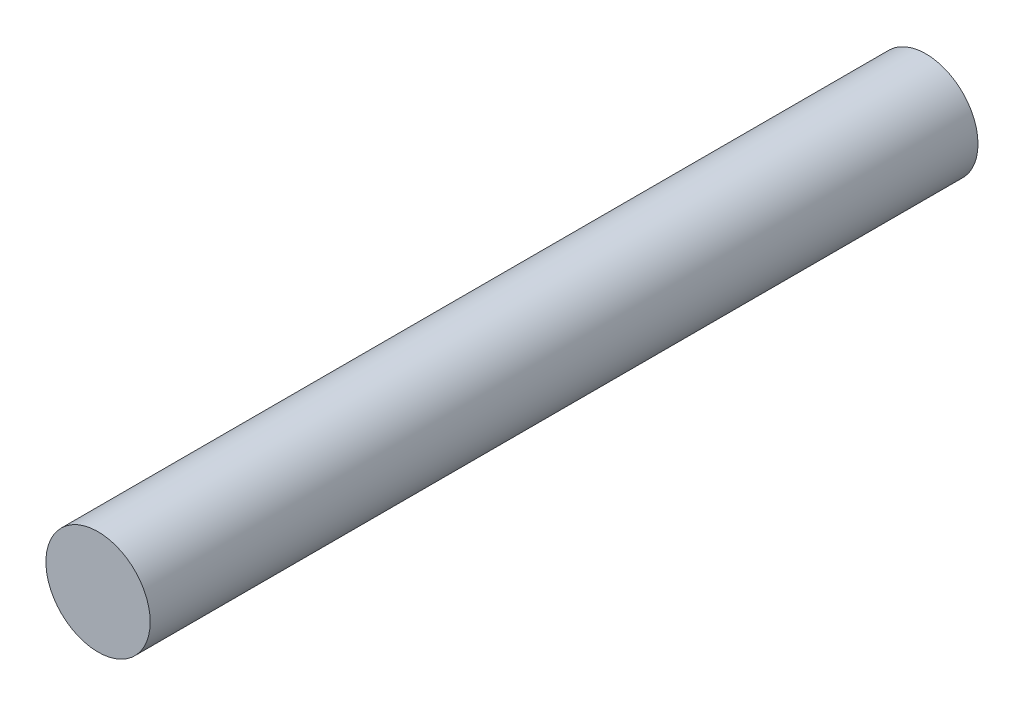
ISO-10303-21;
HEADER;
FILE_DESCRIPTION(('STEP AP214'),'2;1');
FILE_NAME('part.step','',(''),(''),'','','');
FILE_SCHEMA(('AUTOMOTIVE_DESIGN { 1 0 10303 214 1 1 1 1 }'));
ENDSEC;
DATA;
#1=APPLICATION_CONTEXT('core data for automotive mechanical design processes');
#2=APPLICATION_PROTOCOL_DEFINITION('international standard','automotive_design',2000,#1);
#3=PRODUCT_CONTEXT('',#1,'mechanical');
#4=PRODUCT('Part','Part','',(#3));
#5=PRODUCT_RELATED_PRODUCT_CATEGORY('part','',(#4));
#6=PRODUCT_DEFINITION_FORMATION('','',#4);
#7=PRODUCT_DEFINITION_CONTEXT('part definition',#1,'design');
#8=PRODUCT_DEFINITION('design','',#6,#7);
#9=PRODUCT_DEFINITION_SHAPE('','',#8);
#10=(LENGTH_UNIT() NAMED_UNIT(*) SI_UNIT(.MILLI.,.METRE.));
#11=(NAMED_UNIT(*) PLANE_ANGLE_UNIT() SI_UNIT($,.RADIAN.));
#12=(NAMED_UNIT(*) SI_UNIT($,.STERADIAN.) SOLID_ANGLE_UNIT());
#13=UNCERTAINTY_MEASURE_WITH_UNIT(LENGTH_MEASURE(1.E-05),#10,'distance_accuracy_value','');
#14=(GEOMETRIC_REPRESENTATION_CONTEXT(3) GLOBAL_UNCERTAINTY_ASSIGNED_CONTEXT((#13)) GLOBAL_UNIT_ASSIGNED_CONTEXT((#10,
#11,#12)) REPRESENTATION_CONTEXT('',''));
#15=CARTESIAN_POINT('',(0.,0.,0.));
#16=DIRECTION('',(0.,0.,1.));
#17=DIRECTION('',(1.,0.,0.));
#18=AXIS2_PLACEMENT_3D('',#15,#16,#17);
#19=CARTESIAN_POINT('',(0.,0.,31.75));
#20=DIRECTION('',(0.,0.,-1.));
#21=DIRECTION('',(-1.,0.,0.));
#22=AXIS2_PLACEMENT_3D('',#19,#20,#21);
#23=CYLINDRICAL_SURFACE('',#22,1.999996);
#24=CARTESIAN_POINT('',(0.,0.,31.75));
#25=DIRECTION('',(0.,0.,1.));
#26=DIRECTION('',(1.,0.,0.));
#27=AXIS2_PLACEMENT_3D('',#24,#25,#26);
#28=CIRCLE('',#27,1.999996);
#29=CARTESIAN_POINT('',(1.999996,0.,31.75));
#30=VERTEX_POINT('',#29);
#31=EDGE_CURVE('E10',#30,#30,#28,.T.);
#32=ORIENTED_EDGE('',*,*,#31,.F.);
#33=EDGE_LOOP('',(#32));
#34=FACE_BOUND('',#33,.T.);
#35=CARTESIAN_POINT('',(0.,0.,0.));
#36=DIRECTION('',(0.,0.,1.));
#37=DIRECTION('',(1.,0.,0.));
#38=AXIS2_PLACEMENT_3D('',#35,#36,#37);
#39=CIRCLE('',#38,1.999996);
#40=CARTESIAN_POINT('',(1.999996,0.,0.));
#41=VERTEX_POINT('',#40);
#42=EDGE_CURVE('E35',#41,#41,#39,.T.);
#43=ORIENTED_EDGE('',*,*,#42,.T.);
#44=EDGE_LOOP('',(#43));
#45=FACE_BOUND('',#44,.T.);
#46=ADVANCED_FACE('F32',(#34,#45),#23,.T.);
#47=CARTESIAN_POINT('',(0.,0.,31.75));
#48=DIRECTION('',(0.,0.,1.));
#49=DIRECTION('',(1.,0.,0.));
#50=AXIS2_PLACEMENT_3D('',#47,#48,#49);
#51=PLANE('',#50);
#52=ORIENTED_EDGE('',*,*,#31,.T.);
#53=EDGE_LOOP('',(#52));
#54=FACE_BOUND('',#53,.T.);
#55=ADVANCED_FACE('F47',(#54),#51,.T.);
#56=CARTESIAN_POINT('',(0.,0.,0.));
#57=DIRECTION('',(0.,0.,1.));
#58=DIRECTION('',(1.,0.,0.));
#59=AXIS2_PLACEMENT_3D('',#56,#57,#58);
#60=PLANE('',#59);
#61=ORIENTED_EDGE('',*,*,#42,.F.);
#62=EDGE_LOOP('',(#61));
#63=FACE_BOUND('',#62,.T.);
#64=ADVANCED_FACE('F45',(#63),#60,.F.);
#65=CLOSED_SHELL('',(#46,#55,#64));
#66=MANIFOLD_SOLID_BREP('B2',#65);
#67=ADVANCED_BREP_SHAPE_REPRESENTATION('',(#18,#66),#14);
#68=SHAPE_DEFINITION_REPRESENTATION(#9,#67);
ENDSEC;
END-ISO-10303-21;
